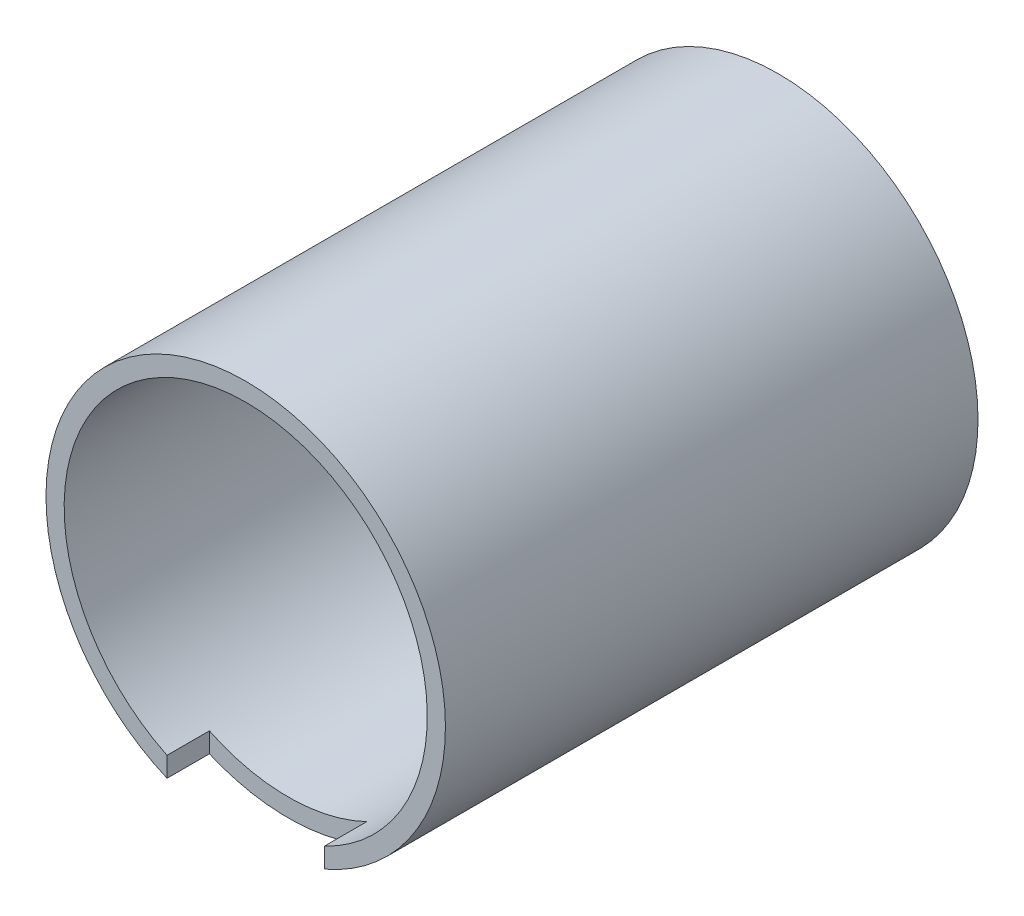
ISO-10303-21;
HEADER;
FILE_DESCRIPTION(('STEP AP214'),'2;1');
FILE_NAME('part.step','',(''),(''),'','','');
FILE_SCHEMA(('AUTOMOTIVE_DESIGN { 1 0 10303 214 1 1 1 1 }'));
ENDSEC;
DATA;
#1=APPLICATION_CONTEXT('core data for automotive mechanical design processes');
#2=APPLICATION_PROTOCOL_DEFINITION('international standard','automotive_design',2000,#1);
#3=PRODUCT_CONTEXT('',#1,'mechanical');
#4=PRODUCT('Part','Part','',(#3));
#5=PRODUCT_RELATED_PRODUCT_CATEGORY('part','',(#4));
#6=PRODUCT_DEFINITION_FORMATION('','',#4);
#7=PRODUCT_DEFINITION_CONTEXT('part definition',#1,'design');
#8=PRODUCT_DEFINITION('design','',#6,#7);
#9=PRODUCT_DEFINITION_SHAPE('','',#8);
#10=(LENGTH_UNIT() NAMED_UNIT(*) SI_UNIT(.MILLI.,.METRE.));
#11=(NAMED_UNIT(*) PLANE_ANGLE_UNIT() SI_UNIT($,.RADIAN.));
#12=(NAMED_UNIT(*) SI_UNIT($,.STERADIAN.) SOLID_ANGLE_UNIT());
#13=UNCERTAINTY_MEASURE_WITH_UNIT(LENGTH_MEASURE(1.E-05),#10,'distance_accuracy_value','');
#14=(GEOMETRIC_REPRESENTATION_CONTEXT(3) GLOBAL_UNCERTAINTY_ASSIGNED_CONTEXT((#13)) GLOBAL_UNIT_ASSIGNED_CONTEXT((#10,
#11,#12)) REPRESENTATION_CONTEXT('',''));
#15=CARTESIAN_POINT('',(0.,0.,0.));
#16=DIRECTION('',(0.,0.,1.));
#17=DIRECTION('',(1.,0.,0.));
#18=AXIS2_PLACEMENT_3D('',#15,#16,#17);
#19=CARTESIAN_POINT('',(0.,0.,44.));
#20=DIRECTION('',(0.,0.,1.));
#21=DIRECTION('',(1.,0.,0.));
#22=AXIS2_PLACEMENT_3D('',#19,#20,#21);
#23=PLANE('',#22);
#24=DIRECTION('',(0.,1.,0.));
#25=VECTOR('',#24,1.);
#26=CARTESIAN_POINT('',(6.5,-44.,44.));
#27=LINE('',#26,#25);
#28=CARTESIAN_POINT('',(6.5,-15.1657508881031,44.));
#29=VERTEX_POINT('',#28);
#30=CARTESIAN_POINT('',(6.5,-13.5185058345958,44.));
#31=VERTEX_POINT('',#30);
#32=EDGE_CURVE('E197',#29,#31,#27,.T.);
#33=ORIENTED_EDGE('',*,*,#32,.F.);
#34=CARTESIAN_POINT('',(0.,0.,44.));
#35=DIRECTION('',(0.,0.,1.));
#36=DIRECTION('',(1.,0.,0.));
#37=AXIS2_PLACEMENT_3D('',#34,#35,#36);
#38=CIRCLE('',#37,16.5);
#39=CARTESIAN_POINT('',(-6.5,-15.1657508881031,44.));
#40=VERTEX_POINT('',#39);
#41=EDGE_CURVE('E152',#29,#40,#38,.T.);
#42=ORIENTED_EDGE('',*,*,#41,.T.);
#43=DIRECTION('',(0.,1.,0.));
#44=VECTOR('',#43,1.);
#45=CARTESIAN_POINT('',(-6.5,-44.,44.));
#46=LINE('',#45,#44);
#47=CARTESIAN_POINT('',(-6.5,-13.5185058345958,44.));
#48=VERTEX_POINT('',#47);
#49=EDGE_CURVE('E105',#40,#48,#46,.T.);
#50=ORIENTED_EDGE('',*,*,#49,.T.);
#51=CARTESIAN_POINT('',(0.,0.,44.));
#52=DIRECTION('',(0.,0.,1.));
#53=DIRECTION('',(1.,0.,0.));
#54=AXIS2_PLACEMENT_3D('',#51,#52,#53);
#55=CIRCLE('',#54,15.);
#56=EDGE_CURVE('E144',#31,#48,#55,.T.);
#57=ORIENTED_EDGE('',*,*,#56,.F.);
#58=EDGE_LOOP('',(#33,#42,#50,#57));
#59=FACE_BOUND('',#58,.T.);
#60=ADVANCED_FACE('F39',(#59),#23,.T.);
#61=CARTESIAN_POINT('',(0.,0.,0.));
#62=DIRECTION('',(0.,0.,1.));
#63=DIRECTION('',(1.,0.,0.));
#64=AXIS2_PLACEMENT_3D('',#61,#62,#63);
#65=PLANE('',#64);
#66=CARTESIAN_POINT('',(0.,0.,0.));
#67=DIRECTION('',(0.,0.,1.));
#68=DIRECTION('',(1.,0.,0.));
#69=AXIS2_PLACEMENT_3D('',#66,#67,#68);
#70=CIRCLE('',#69,16.5);
#71=CARTESIAN_POINT('',(6.5,-15.1657508881031,0.));
#72=VERTEX_POINT('',#71);
#73=CARTESIAN_POINT('',(-6.5,-15.1657508881031,0.));
#74=VERTEX_POINT('',#73);
#75=EDGE_CURVE('E148',#72,#74,#70,.T.);
#76=ORIENTED_EDGE('',*,*,#75,.F.);
#77=DIRECTION('',(0.,1.,0.));
#78=VECTOR('',#77,1.);
#79=CARTESIAN_POINT('',(6.5,-44.,0.));
#80=LINE('',#79,#78);
#81=CARTESIAN_POINT('',(6.5,-13.5185058345958,0.));
#82=VERTEX_POINT('',#81);
#83=EDGE_CURVE('E190',#72,#82,#80,.T.);
#84=ORIENTED_EDGE('',*,*,#83,.T.);
#85=CARTESIAN_POINT('',(0.,0.,0.));
#86=DIRECTION('',(0.,0.,1.));
#87=DIRECTION('',(1.,0.,0.));
#88=AXIS2_PLACEMENT_3D('',#85,#86,#87);
#89=CIRCLE('',#88,15.);
#90=CARTESIAN_POINT('',(-6.5,-13.5185058345958,0.));
#91=VERTEX_POINT('',#90);
#92=EDGE_CURVE('E143',#82,#91,#89,.T.);
#93=ORIENTED_EDGE('',*,*,#92,.T.);
#94=DIRECTION('',(0.,1.,0.));
#95=VECTOR('',#94,1.);
#96=CARTESIAN_POINT('',(-6.5,-44.,0.));
#97=LINE('',#96,#95);
#98=EDGE_CURVE('E63',#74,#91,#97,.T.);
#99=ORIENTED_EDGE('',*,*,#98,.F.);
#100=EDGE_LOOP('',(#76,#84,#93,#99));
#101=FACE_BOUND('',#100,.T.);
#102=ADVANCED_FACE('F189',(#101),#65,.F.);
#103=CARTESIAN_POINT('',(0.,0.,44.));
#104=DIRECTION('',(0.,0.,-1.));
#105=DIRECTION('',(-1.,0.,0.));
#106=AXIS2_PLACEMENT_3D('',#103,#104,#105);
#107=CYLINDRICAL_SURFACE('',#106,16.5);
#108=ORIENTED_EDGE('',*,*,#41,.F.);
#109=DIRECTION('',(0.,0.,-1.));
#110=VECTOR('',#109,1.);
#111=CARTESIAN_POINT('',(6.5,-15.1657508881031,44.));
#112=LINE('',#111,#110);
#113=CARTESIAN_POINT('',(6.5,-15.1657508881031,40.5));
#114=VERTEX_POINT('',#113);
#115=EDGE_CURVE('E111',#29,#114,#112,.T.);
#116=ORIENTED_EDGE('',*,*,#115,.T.);
#117=CARTESIAN_POINT('',(0.,0.,40.5));
#118=DIRECTION('',(0.,0.,-1.));
#119=DIRECTION('',(-1.,0.,0.));
#120=AXIS2_PLACEMENT_3D('',#117,#118,#119);
#121=CIRCLE('',#120,16.5);
#122=CARTESIAN_POINT('',(-6.5,-15.1657508881031,40.5));
#123=VERTEX_POINT('',#122);
#124=EDGE_CURVE('E117',#114,#123,#121,.T.);
#125=ORIENTED_EDGE('',*,*,#124,.T.);
#126=DIRECTION('',(0.,0.,-1.));
#127=VECTOR('',#126,1.);
#128=CARTESIAN_POINT('',(-6.5,-15.1657508881031,44.));
#129=LINE('',#128,#127);
#130=EDGE_CURVE('E102',#123,#40,#129,.F.);
#131=ORIENTED_EDGE('',*,*,#130,.T.);
#132=EDGE_LOOP('',(#108,#116,#125,#131));
#133=FACE_BOUND('',#132,.T.);
#134=CARTESIAN_POINT('',(0.,0.,3.5));
#135=DIRECTION('',(0.,0.,1.));
#136=DIRECTION('',(1.,0.,0.));
#137=AXIS2_PLACEMENT_3D('',#134,#135,#136);
#138=CIRCLE('',#137,16.5);
#139=CARTESIAN_POINT('',(-6.5,-15.1657508881031,3.5));
#140=VERTEX_POINT('',#139);
#141=CARTESIAN_POINT('',(6.5,-15.1657508881031,3.49999999999999));
#142=VERTEX_POINT('',#141);
#143=EDGE_CURVE('E132',#140,#142,#138,.T.);
#144=ORIENTED_EDGE('',*,*,#143,.T.);
#145=DIRECTION('',(0.,0.,-1.));
#146=VECTOR('',#145,1.);
#147=CARTESIAN_POINT('',(6.50000000000002,-15.1657508881031,44.));
#148=LINE('',#147,#146);
#149=EDGE_CURVE('E139',#142,#72,#148,.T.);
#150=ORIENTED_EDGE('',*,*,#149,.T.);
#151=ORIENTED_EDGE('',*,*,#75,.T.);
#152=DIRECTION('',(0.,0.,-1.));
#153=VECTOR('',#152,1.);
#154=CARTESIAN_POINT('',(-6.5,-15.1657508881031,44.));
#155=LINE('',#154,#153);
#156=EDGE_CURVE('E127',#74,#140,#155,.F.);
#157=ORIENTED_EDGE('',*,*,#156,.T.);
#158=EDGE_LOOP('',(#144,#150,#151,#157));
#159=FACE_BOUND('',#158,.T.);
#160=ADVANCED_FACE('F41',(#133,#159),#107,.T.);
#161=CARTESIAN_POINT('',(0.,0.,44.));
#162=DIRECTION('',(0.,0.,-1.));
#163=DIRECTION('',(-1.,0.,0.));
#164=AXIS2_PLACEMENT_3D('',#161,#162,#163);
#165=CYLINDRICAL_SURFACE('',#164,15.);
#166=DIRECTION('',(0.,0.,-1.));
#167=VECTOR('',#166,1.);
#168=CARTESIAN_POINT('',(6.50000000000002,-13.5185058345958,44.));
#169=LINE('',#168,#167);
#170=CARTESIAN_POINT('',(6.5,-13.5185058345958,3.49999999999999));
#171=VERTEX_POINT('',#170);
#172=EDGE_CURVE('E11',#171,#82,#169,.T.);
#173=ORIENTED_EDGE('',*,*,#172,.F.);
#174=CARTESIAN_POINT('',(0.,0.,3.5));
#175=DIRECTION('',(0.,0.,1.));
#176=DIRECTION('',(1.,0.,0.));
#177=AXIS2_PLACEMENT_3D('',#174,#175,#176);
#178=CIRCLE('',#177,15.);
#179=CARTESIAN_POINT('',(-6.5,-13.5185058345958,3.5));
#180=VERTEX_POINT('',#179);
#181=EDGE_CURVE('E48',#180,#171,#178,.T.);
#182=ORIENTED_EDGE('',*,*,#181,.F.);
#183=DIRECTION('',(0.,0.,-1.));
#184=VECTOR('',#183,1.);
#185=CARTESIAN_POINT('',(-6.5,-13.5185058345958,44.));
#186=LINE('',#185,#184);
#187=EDGE_CURVE('E166',#91,#180,#186,.F.);
#188=ORIENTED_EDGE('',*,*,#187,.F.);
#189=ORIENTED_EDGE('',*,*,#92,.F.);
#190=EDGE_LOOP('',(#173,#182,#188,#189));
#191=FACE_BOUND('',#190,.T.);
#192=DIRECTION('',(0.,0.,-1.));
#193=VECTOR('',#192,1.);
#194=CARTESIAN_POINT('',(6.5,-13.5185058345958,44.));
#195=LINE('',#194,#193);
#196=CARTESIAN_POINT('',(6.5,-13.5185058345958,40.5));
#197=VERTEX_POINT('',#196);
#198=EDGE_CURVE('E163',#31,#197,#195,.T.);
#199=ORIENTED_EDGE('',*,*,#198,.F.);
#200=ORIENTED_EDGE('',*,*,#56,.T.);
#201=DIRECTION('',(0.,0.,-1.));
#202=VECTOR('',#201,1.);
#203=CARTESIAN_POINT('',(-6.5,-13.5185058345958,44.));
#204=LINE('',#203,#202);
#205=CARTESIAN_POINT('',(-6.5,-13.5185058345958,40.5));
#206=VERTEX_POINT('',#205);
#207=EDGE_CURVE('E155',#206,#48,#204,.F.);
#208=ORIENTED_EDGE('',*,*,#207,.F.);
#209=CARTESIAN_POINT('',(0.,0.,40.5));
#210=DIRECTION('',(0.,0.,-1.));
#211=DIRECTION('',(-1.,0.,0.));
#212=AXIS2_PLACEMENT_3D('',#209,#210,#211);
#213=CIRCLE('',#212,15.);
#214=EDGE_CURVE('E120',#197,#206,#213,.T.);
#215=ORIENTED_EDGE('',*,*,#214,.F.);
#216=EDGE_LOOP('',(#199,#200,#208,#215));
#217=FACE_BOUND('',#216,.T.);
#218=ADVANCED_FACE('F185',(#191,#217),#165,.F.);
#219=CARTESIAN_POINT('',(6.5,-44.,40.5));
#220=DIRECTION('',(0.,0.,-1.));
#221=DIRECTION('',(-1.,0.,0.));
#222=AXIS2_PLACEMENT_3D('',#219,#220,#221);
#223=PLANE('',#222);
#224=DIRECTION('',(0.,1.,0.));
#225=VECTOR('',#224,1.);
#226=CARTESIAN_POINT('',(6.5,-44.,40.5));
#227=LINE('',#226,#225);
#228=EDGE_CURVE('E192',#114,#197,#227,.T.);
#229=ORIENTED_EDGE('',*,*,#228,.T.);
#230=ORIENTED_EDGE('',*,*,#214,.T.);
#231=DIRECTION('',(0.,1.,0.));
#232=VECTOR('',#231,1.);
#233=CARTESIAN_POINT('',(-6.5,-44.,40.5));
#234=LINE('',#233,#232);
#235=EDGE_CURVE('E55',#123,#206,#234,.T.);
#236=ORIENTED_EDGE('',*,*,#235,.F.);
#237=ORIENTED_EDGE('',*,*,#124,.F.);
#238=EDGE_LOOP('',(#229,#230,#236,#237));
#239=FACE_BOUND('',#238,.T.);
#240=ADVANCED_FACE('F116',(#239),#223,.F.);
#241=CARTESIAN_POINT('',(6.5,-44.,44.));
#242=DIRECTION('',(1.,0.,0.));
#243=DIRECTION('',(0.,0.,-1.));
#244=AXIS2_PLACEMENT_3D('',#241,#242,#243);
#245=PLANE('',#244);
#246=ORIENTED_EDGE('',*,*,#32,.T.);
#247=ORIENTED_EDGE('',*,*,#198,.T.);
#248=ORIENTED_EDGE('',*,*,#228,.F.);
#249=ORIENTED_EDGE('',*,*,#115,.F.);
#250=EDGE_LOOP('',(#246,#247,#248,#249));
#251=FACE_BOUND('',#250,.T.);
#252=ADVANCED_FACE('F209',(#251),#245,.F.);
#253=CARTESIAN_POINT('',(-6.5,-44.,40.5));
#254=DIRECTION('',(-1.,0.,0.));
#255=DIRECTION('',(0.,0.,1.));
#256=AXIS2_PLACEMENT_3D('',#253,#254,#255);
#257=PLANE('',#256);
#258=ORIENTED_EDGE('',*,*,#235,.T.);
#259=ORIENTED_EDGE('',*,*,#207,.T.);
#260=ORIENTED_EDGE('',*,*,#49,.F.);
#261=ORIENTED_EDGE('',*,*,#130,.F.);
#262=EDGE_LOOP('',(#258,#259,#260,#261));
#263=FACE_BOUND('',#262,.T.);
#264=ADVANCED_FACE('F103',(#263),#257,.F.);
#265=CARTESIAN_POINT('',(6.5,-44.,0.));
#266=DIRECTION('',(1.,0.,0.));
#267=DIRECTION('',(0.,0.,-1.));
#268=AXIS2_PLACEMENT_3D('',#265,#266,#267);
#269=PLANE('',#268);
#270=DIRECTION('',(0.,1.,0.));
#271=VECTOR('',#270,1.);
#272=CARTESIAN_POINT('',(6.5,-44.,3.5));
#273=LINE('',#272,#271);
#274=EDGE_CURVE('E112',#142,#171,#273,.T.);
#275=ORIENTED_EDGE('',*,*,#274,.T.);
#276=ORIENTED_EDGE('',*,*,#172,.T.);
#277=ORIENTED_EDGE('',*,*,#83,.F.);
#278=ORIENTED_EDGE('',*,*,#149,.F.);
#279=EDGE_LOOP('',(#275,#276,#277,#278));
#280=FACE_BOUND('',#279,.T.);
#281=ADVANCED_FACE('F180',(#280),#269,.F.);
#282=CARTESIAN_POINT('',(6.5,-44.,3.5));
#283=DIRECTION('',(0.,0.,1.));
#284=DIRECTION('',(1.,0.,0.));
#285=AXIS2_PLACEMENT_3D('',#282,#283,#284);
#286=PLANE('',#285);
#287=DIRECTION('',(0.,1.,0.));
#288=VECTOR('',#287,1.);
#289=CARTESIAN_POINT('',(-6.5,-44.,3.5));
#290=LINE('',#289,#288);
#291=EDGE_CURVE('E176',#140,#180,#290,.T.);
#292=ORIENTED_EDGE('',*,*,#291,.T.);
#293=ORIENTED_EDGE('',*,*,#181,.T.);
#294=ORIENTED_EDGE('',*,*,#274,.F.);
#295=ORIENTED_EDGE('',*,*,#143,.F.);
#296=EDGE_LOOP('',(#292,#293,#294,#295));
#297=FACE_BOUND('',#296,.T.);
#298=ADVANCED_FACE('F174',(#297),#286,.F.);
#299=CARTESIAN_POINT('',(-6.5,-44.,3.5));
#300=DIRECTION('',(-1.,0.,0.));
#301=DIRECTION('',(0.,0.,1.));
#302=AXIS2_PLACEMENT_3D('',#299,#300,#301);
#303=PLANE('',#302);
#304=ORIENTED_EDGE('',*,*,#98,.T.);
#305=ORIENTED_EDGE('',*,*,#187,.T.);
#306=ORIENTED_EDGE('',*,*,#291,.F.);
#307=ORIENTED_EDGE('',*,*,#156,.F.);
#308=EDGE_LOOP('',(#304,#305,#306,#307));
#309=FACE_BOUND('',#308,.T.);
#310=ADVANCED_FACE('F275',(#309),#303,.F.);
#311=CLOSED_SHELL('',(#60,#102,#160,#218,#240,#252,#264,#281,#298,#310));
#312=MANIFOLD_SOLID_BREP('B2',#311);
#313=ADVANCED_BREP_SHAPE_REPRESENTATION('',(#18,#312),#14);
#314=SHAPE_DEFINITION_REPRESENTATION(#9,#313);
ENDSEC;
END-ISO-10303-21;
